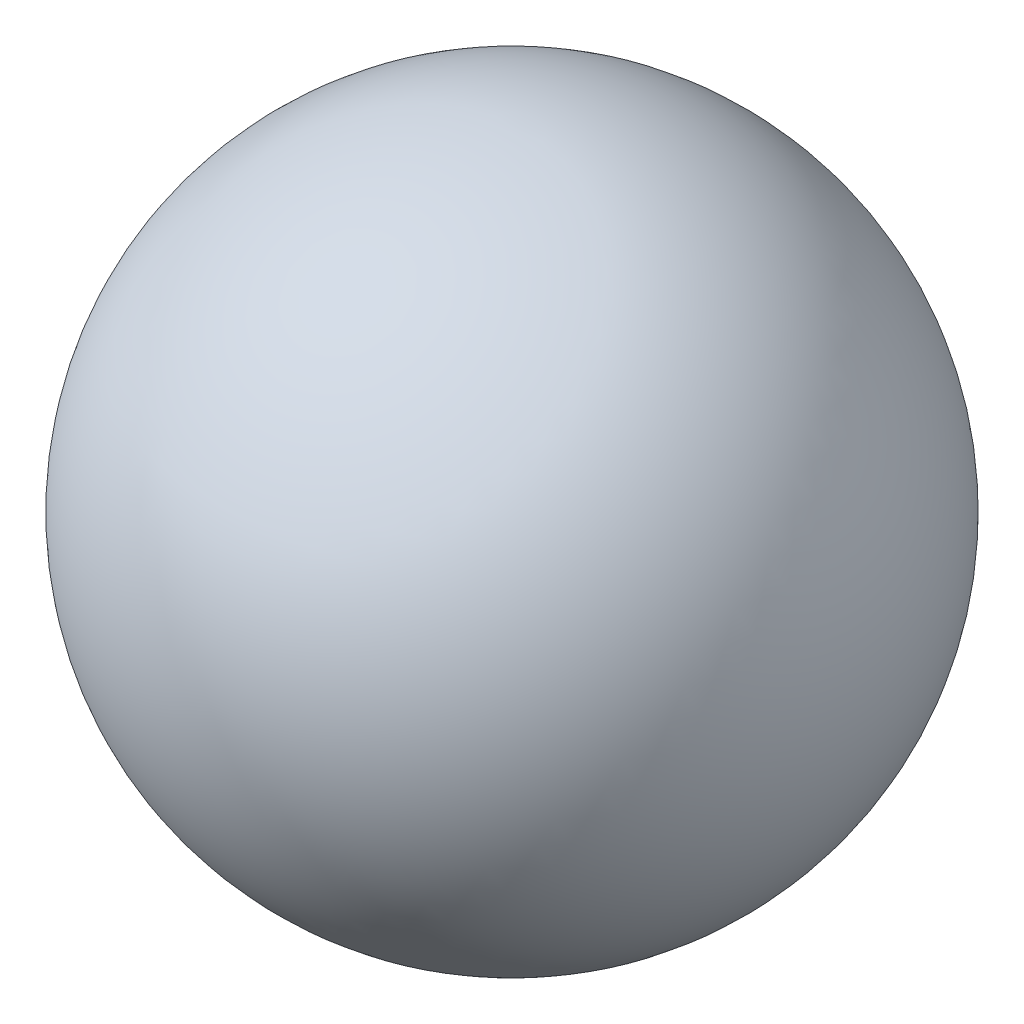
ISO-10303-21;
HEADER;
FILE_DESCRIPTION(('STEP AP214'),'2;1');
FILE_NAME('part.step','',(''),(''),'','','');
FILE_SCHEMA(('AUTOMOTIVE_DESIGN { 1 0 10303 214 1 1 1 1 }'));
ENDSEC;
DATA;
#1=APPLICATION_CONTEXT('core data for automotive mechanical design processes');
#2=APPLICATION_PROTOCOL_DEFINITION('international standard','automotive_design',2000,#1);
#3=PRODUCT_CONTEXT('',#1,'mechanical');
#4=PRODUCT('Part','Part','',(#3));
#5=PRODUCT_RELATED_PRODUCT_CATEGORY('part','',(#4));
#6=PRODUCT_DEFINITION_FORMATION('','',#4);
#7=PRODUCT_DEFINITION_CONTEXT('part definition',#1,'design');
#8=PRODUCT_DEFINITION('design','',#6,#7);
#9=PRODUCT_DEFINITION_SHAPE('','',#8);
#10=(LENGTH_UNIT() NAMED_UNIT(*) SI_UNIT(.MILLI.,.METRE.));
#11=(NAMED_UNIT(*) PLANE_ANGLE_UNIT() SI_UNIT($,.RADIAN.));
#12=(NAMED_UNIT(*) SI_UNIT($,.STERADIAN.) SOLID_ANGLE_UNIT());
#13=UNCERTAINTY_MEASURE_WITH_UNIT(LENGTH_MEASURE(1.E-05),#10,'distance_accuracy_value','');
#14=(GEOMETRIC_REPRESENTATION_CONTEXT(3) GLOBAL_UNCERTAINTY_ASSIGNED_CONTEXT((#13)) GLOBAL_UNIT_ASSIGNED_CONTEXT((#10,
#11,#12)) REPRESENTATION_CONTEXT('',''));
#15=CARTESIAN_POINT('',(0.,0.,0.));
#16=DIRECTION('',(0.,0.,1.));
#17=DIRECTION('',(1.,0.,0.));
#18=AXIS2_PLACEMENT_3D('',#15,#16,#17);
#19=CARTESIAN_POINT('',(0.,5.75,0.));
#20=DIRECTION('',(0.,-1.,0.));
#21=DIRECTION('',(-1.,0.,0.));
#22=AXIS2_PLACEMENT_3D('',#19,#20,#21);
#23=SPHERICAL_SURFACE('',#22,5.75);
#24=CARTESIAN_POINT('',(0.,0.,0.));
#25=VERTEX_POINT('',#24);
#26=VERTEX_LOOP('',#25);
#27=FACE_BOUND('',#26,.T.);
#28=ADVANCED_FACE('F28',(#27),#23,.T.);
#29=CLOSED_SHELL('',(#28));
#30=MANIFOLD_SOLID_BREP('B2',#29);
#31=ADVANCED_BREP_SHAPE_REPRESENTATION('',(#18,#30),#14);
#32=SHAPE_DEFINITION_REPRESENTATION(#9,#31);
ENDSEC;
END-ISO-10303-21;
